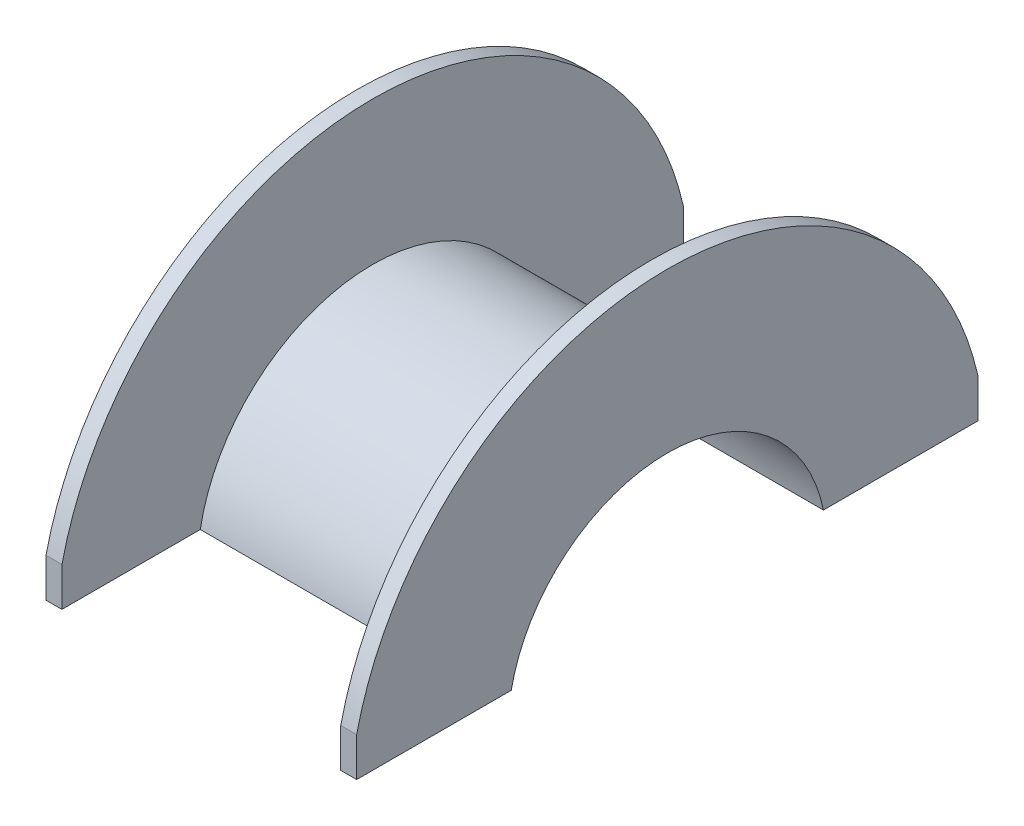
ISO-10303-21;
HEADER;
FILE_DESCRIPTION(('STEP AP214'),'2;1');
FILE_NAME('part.step','',(''),(''),'','','');
FILE_SCHEMA(('AUTOMOTIVE_DESIGN { 1 0 10303 214 1 1 1 1 }'));
ENDSEC;
DATA;
#1=APPLICATION_CONTEXT('core data for automotive mechanical design processes');
#2=APPLICATION_PROTOCOL_DEFINITION('international standard','automotive_design',2000,#1);
#3=PRODUCT_CONTEXT('',#1,'mechanical');
#4=PRODUCT('Part','Part','',(#3));
#5=PRODUCT_RELATED_PRODUCT_CATEGORY('part','',(#4));
#6=PRODUCT_DEFINITION_FORMATION('','',#4);
#7=PRODUCT_DEFINITION_CONTEXT('part definition',#1,'design');
#8=PRODUCT_DEFINITION('design','',#6,#7);
#9=PRODUCT_DEFINITION_SHAPE('','',#8);
#10=(LENGTH_UNIT() NAMED_UNIT(*) SI_UNIT(.MILLI.,.METRE.));
#11=(NAMED_UNIT(*) PLANE_ANGLE_UNIT() SI_UNIT($,.RADIAN.));
#12=(NAMED_UNIT(*) SI_UNIT($,.STERADIAN.) SOLID_ANGLE_UNIT());
#13=UNCERTAINTY_MEASURE_WITH_UNIT(LENGTH_MEASURE(1.E-05),#10,'distance_accuracy_value','');
#14=(GEOMETRIC_REPRESENTATION_CONTEXT(3) GLOBAL_UNCERTAINTY_ASSIGNED_CONTEXT((#13)) GLOBAL_UNIT_ASSIGNED_CONTEXT((#10,
#11,#12)) REPRESENTATION_CONTEXT('',''));
#15=CARTESIAN_POINT('',(0.,0.,0.));
#16=DIRECTION('',(0.,0.,1.));
#17=DIRECTION('',(1.,0.,0.));
#18=AXIS2_PLACEMENT_3D('',#15,#16,#17);
#19=CARTESIAN_POINT('',(-9.75,20.,0.));
#20=DIRECTION('',(1.,0.,0.));
#21=DIRECTION('',(0.,0.,-1.));
#22=AXIS2_PLACEMENT_3D('',#19,#20,#21);
#23=PLANE('',#22);
#24=CARTESIAN_POINT('',(-9.75,0.,0.));
#25=DIRECTION('',(-1.,0.,0.));
#26=DIRECTION('',(0.,0.,1.));
#27=AXIS2_PLACEMENT_3D('',#24,#25,#26);
#28=CIRCLE('',#27,20.);
#29=CARTESIAN_POINT('',(-9.75,4.4440972086578,19.5));
#30=VERTEX_POINT('',#29);
#31=CARTESIAN_POINT('',(-9.75,4.4440972086578,-19.5));
#32=VERTEX_POINT('',#31);
#33=EDGE_CURVE('E214',#30,#32,#28,.T.);
#34=ORIENTED_EDGE('',*,*,#33,.T.);
#35=DIRECTION('',(0.,-1.,0.));
#36=VECTOR('',#35,1.);
#37=CARTESIAN_POINT('',(-9.75,20.,-19.5));
#38=LINE('',#37,#36);
#39=CARTESIAN_POINT('',(-9.75,2.,-19.5));
#40=VERTEX_POINT('',#39);
#41=EDGE_CURVE('E173',#32,#40,#38,.T.);
#42=ORIENTED_EDGE('',*,*,#41,.T.);
#43=DIRECTION('',(0.,0.,1.));
#44=VECTOR('',#43,1.);
#45=CARTESIAN_POINT('',(-9.75,2.,0.));
#46=LINE('',#45,#44);
#47=CARTESIAN_POINT('',(-9.75,2.,-9.79795897113272));
#48=VERTEX_POINT('',#47);
#49=EDGE_CURVE('E206',#40,#48,#46,.T.);
#50=ORIENTED_EDGE('',*,*,#49,.T.);
#51=CARTESIAN_POINT('',(-9.75,0.,0.));
#52=DIRECTION('',(-1.,0.,0.));
#53=DIRECTION('',(0.,0.,1.));
#54=AXIS2_PLACEMENT_3D('',#51,#52,#53);
#55=CIRCLE('',#54,10.);
#56=CARTESIAN_POINT('',(-9.75,2.,9.79795897113272));
#57=VERTEX_POINT('',#56);
#58=EDGE_CURVE('E142',#57,#48,#55,.T.);
#59=ORIENTED_EDGE('',*,*,#58,.F.);
#60=CARTESIAN_POINT('',(-9.75,2.,19.5));
#61=VERTEX_POINT('',#60);
#62=EDGE_CURVE('E203',#57,#61,#46,.T.);
#63=ORIENTED_EDGE('',*,*,#62,.T.);
#64=DIRECTION('',(0.,1.,0.));
#65=VECTOR('',#64,1.);
#66=CARTESIAN_POINT('',(-9.75,20.,19.5));
#67=LINE('',#66,#65);
#68=EDGE_CURVE('E184',#61,#30,#67,.T.);
#69=ORIENTED_EDGE('',*,*,#68,.T.);
#70=EDGE_LOOP('',(#34,#42,#50,#59,#63,#69));
#71=FACE_BOUND('',#70,.T.);
#72=ADVANCED_FACE('F33',(#71),#23,.F.);
#73=CARTESIAN_POINT('',(-17.3367237687366,0.,0.));
#74=DIRECTION('',(-1.,0.,0.));
#75=DIRECTION('',(0.,0.,1.));
#76=AXIS2_PLACEMENT_3D('',#73,#74,#75);
#77=CYLINDRICAL_SURFACE('',#76,10.);
#78=ORIENTED_EDGE('',*,*,#58,.T.);
#79=DIRECTION('',(-1.,0.,0.));
#80=VECTOR('',#79,1.);
#81=CARTESIAN_POINT('',(-17.3367237687366,2.,-9.79795897113272));
#82=LINE('',#81,#80);
#83=CARTESIAN_POINT('',(9.75,2.,-9.79795897113272));
#84=VERTEX_POINT('',#83);
#85=EDGE_CURVE('E212',#48,#84,#82,.F.);
#86=ORIENTED_EDGE('',*,*,#85,.T.);
#87=CARTESIAN_POINT('',(9.75,0.,0.));
#88=DIRECTION('',(-1.,0.,0.));
#89=DIRECTION('',(0.,0.,1.));
#90=AXIS2_PLACEMENT_3D('',#87,#88,#89);
#91=CIRCLE('',#90,10.);
#92=CARTESIAN_POINT('',(9.75,2.,9.79795897113272));
#93=VERTEX_POINT('',#92);
#94=EDGE_CURVE('E139',#93,#84,#91,.T.);
#95=ORIENTED_EDGE('',*,*,#94,.F.);
#96=DIRECTION('',(-1.,0.,0.));
#97=VECTOR('',#96,1.);
#98=CARTESIAN_POINT('',(-17.3367237687366,2.,9.79795897113272));
#99=LINE('',#98,#97);
#100=EDGE_CURVE('E205',#93,#57,#99,.T.);
#101=ORIENTED_EDGE('',*,*,#100,.T.);
#102=EDGE_LOOP('',(#78,#86,#95,#101));
#103=FACE_BOUND('',#102,.T.);
#104=ADVANCED_FACE('F242',(#103),#77,.F.);
#105=CARTESIAN_POINT('',(9.75,20.,0.));
#106=DIRECTION('',(-1.,0.,0.));
#107=DIRECTION('',(0.,0.,1.));
#108=AXIS2_PLACEMENT_3D('',#105,#106,#107);
#109=PLANE('',#108);
#110=DIRECTION('',(0.,0.,1.));
#111=VECTOR('',#110,1.);
#112=CARTESIAN_POINT('',(9.75,2.,26.9171821290084));
#113=LINE('',#112,#111);
#114=CARTESIAN_POINT('',(9.75,2.,-19.5));
#115=VERTEX_POINT('',#114);
#116=EDGE_CURVE('E134',#115,#84,#113,.T.);
#117=ORIENTED_EDGE('',*,*,#116,.F.);
#118=DIRECTION('',(0.,-1.,0.));
#119=VECTOR('',#118,1.);
#120=CARTESIAN_POINT('',(9.75,-1.1099524335408,-19.5));
#121=LINE('',#120,#119);
#122=CARTESIAN_POINT('',(9.75,4.44409720865778,-19.5));
#123=VERTEX_POINT('',#122);
#124=EDGE_CURVE('E47',#123,#115,#121,.T.);
#125=ORIENTED_EDGE('',*,*,#124,.F.);
#126=CARTESIAN_POINT('',(9.75,0.,0.));
#127=DIRECTION('',(-1.,0.,0.));
#128=DIRECTION('',(0.,0.,1.));
#129=AXIS2_PLACEMENT_3D('',#126,#127,#128);
#130=CIRCLE('',#129,20.);
#131=CARTESIAN_POINT('',(9.75,4.44409720865778,19.5));
#132=VERTEX_POINT('',#131);
#133=EDGE_CURVE('E132',#132,#123,#130,.T.);
#134=ORIENTED_EDGE('',*,*,#133,.F.);
#135=DIRECTION('',(0.,1.,0.));
#136=VECTOR('',#135,1.);
#137=CARTESIAN_POINT('',(9.75,-1.47581202367799,19.5));
#138=LINE('',#137,#136);
#139=CARTESIAN_POINT('',(9.75,2.,19.5));
#140=VERTEX_POINT('',#139);
#141=EDGE_CURVE('E179',#140,#132,#138,.T.);
#142=ORIENTED_EDGE('',*,*,#141,.F.);
#143=EDGE_CURVE('E193',#93,#140,#113,.T.);
#144=ORIENTED_EDGE('',*,*,#143,.F.);
#145=ORIENTED_EDGE('',*,*,#94,.T.);
#146=EDGE_LOOP('',(#117,#125,#134,#142,#144,#145));
#147=FACE_BOUND('',#146,.T.);
#148=ADVANCED_FACE('F130',(#147),#109,.F.);
#149=CARTESIAN_POINT('',(-17.3367237687366,0.,0.));
#150=DIRECTION('',(-1.,0.,0.));
#151=DIRECTION('',(0.,0.,1.));
#152=AXIS2_PLACEMENT_3D('',#149,#150,#151);
#153=CYLINDRICAL_SURFACE('',#152,20.);
#154=ORIENTED_EDGE('',*,*,#133,.T.);
#155=DIRECTION('',(-1.,0.,0.));
#156=VECTOR('',#155,1.);
#157=CARTESIAN_POINT('',(-17.3367237687366,4.44409720865778,-19.5));
#158=LINE('',#157,#156);
#159=CARTESIAN_POINT('',(8.75,4.4440972086578,-19.5));
#160=VERTEX_POINT('',#159);
#161=EDGE_CURVE('E118',#123,#160,#158,.T.);
#162=ORIENTED_EDGE('',*,*,#161,.T.);
#163=CARTESIAN_POINT('',(8.75,0.,0.));
#164=DIRECTION('',(-1.,0.,0.));
#165=DIRECTION('',(0.,0.,1.));
#166=AXIS2_PLACEMENT_3D('',#163,#164,#165);
#167=CIRCLE('',#166,20.);
#168=CARTESIAN_POINT('',(8.75,4.4440972086578,19.5));
#169=VERTEX_POINT('',#168);
#170=EDGE_CURVE('E140',#169,#160,#167,.T.);
#171=ORIENTED_EDGE('',*,*,#170,.F.);
#172=DIRECTION('',(-1.,0.,0.));
#173=VECTOR('',#172,1.);
#174=CARTESIAN_POINT('',(-17.3367237687366,4.44409720865778,19.5));
#175=LINE('',#174,#173);
#176=EDGE_CURVE('E138',#169,#132,#175,.F.);
#177=ORIENTED_EDGE('',*,*,#176,.T.);
#178=EDGE_LOOP('',(#154,#162,#171,#177));
#179=FACE_BOUND('',#178,.T.);
#180=ADVANCED_FACE('F137',(#179),#153,.T.);
#181=CARTESIAN_POINT('',(8.75,11.,0.));
#182=DIRECTION('',(1.,0.,0.));
#183=DIRECTION('',(0.,0.,-1.));
#184=AXIS2_PLACEMENT_3D('',#181,#182,#183);
#185=PLANE('',#184);
#186=ORIENTED_EDGE('',*,*,#170,.T.);
#187=DIRECTION('',(0.,-1.,0.));
#188=VECTOR('',#187,1.);
#189=CARTESIAN_POINT('',(8.75,11.,-19.5));
#190=LINE('',#189,#188);
#191=CARTESIAN_POINT('',(8.75,2.,-19.5));
#192=VERTEX_POINT('',#191);
#193=EDGE_CURVE('E121',#160,#192,#190,.T.);
#194=ORIENTED_EDGE('',*,*,#193,.T.);
#195=DIRECTION('',(0.,0.,1.));
#196=VECTOR('',#195,1.);
#197=CARTESIAN_POINT('',(8.75,2.,0.));
#198=LINE('',#197,#196);
#199=CARTESIAN_POINT('',(8.75,2.,-10.816653826392));
#200=VERTEX_POINT('',#199);
#201=EDGE_CURVE('E165',#192,#200,#198,.T.);
#202=ORIENTED_EDGE('',*,*,#201,.T.);
#203=CARTESIAN_POINT('',(8.75,0.,0.));
#204=DIRECTION('',(-1.,0.,0.));
#205=DIRECTION('',(0.,0.,1.));
#206=AXIS2_PLACEMENT_3D('',#203,#204,#205);
#207=CIRCLE('',#206,11.);
#208=CARTESIAN_POINT('',(8.75,2.,10.816653826392));
#209=VERTEX_POINT('',#208);
#210=EDGE_CURVE('E144',#209,#200,#207,.T.);
#211=ORIENTED_EDGE('',*,*,#210,.F.);
#212=CARTESIAN_POINT('',(8.75,2.,19.5));
#213=VERTEX_POINT('',#212);
#214=EDGE_CURVE('E201',#209,#213,#198,.T.);
#215=ORIENTED_EDGE('',*,*,#214,.T.);
#216=DIRECTION('',(0.,1.,0.));
#217=VECTOR('',#216,1.);
#218=CARTESIAN_POINT('',(8.75,11.,19.5));
#219=LINE('',#218,#217);
#220=EDGE_CURVE('E190',#213,#169,#219,.T.);
#221=ORIENTED_EDGE('',*,*,#220,.T.);
#222=EDGE_LOOP('',(#186,#194,#202,#211,#215,#221));
#223=FACE_BOUND('',#222,.T.);
#224=ADVANCED_FACE('F167',(#223),#185,.F.);
#225=CARTESIAN_POINT('',(-17.3367237687366,0.,0.));
#226=DIRECTION('',(-1.,0.,0.));
#227=DIRECTION('',(0.,0.,1.));
#228=AXIS2_PLACEMENT_3D('',#225,#226,#227);
#229=CYLINDRICAL_SURFACE('',#228,11.);
#230=ORIENTED_EDGE('',*,*,#210,.T.);
#231=DIRECTION('',(-1.,0.,0.));
#232=VECTOR('',#231,1.);
#233=CARTESIAN_POINT('',(-17.3367237687366,2.,-10.816653826392));
#234=LINE('',#233,#232);
#235=CARTESIAN_POINT('',(-8.75,2.,-10.816653826392));
#236=VERTEX_POINT('',#235);
#237=EDGE_CURVE('E209',#200,#236,#234,.T.);
#238=ORIENTED_EDGE('',*,*,#237,.T.);
#239=CARTESIAN_POINT('',(-8.75,0.,0.));
#240=DIRECTION('',(-1.,0.,0.));
#241=DIRECTION('',(0.,0.,1.));
#242=AXIS2_PLACEMENT_3D('',#239,#240,#241);
#243=CIRCLE('',#242,11.);
#244=CARTESIAN_POINT('',(-8.75,2.,10.816653826392));
#245=VERTEX_POINT('',#244);
#246=EDGE_CURVE('E220',#245,#236,#243,.T.);
#247=ORIENTED_EDGE('',*,*,#246,.F.);
#248=DIRECTION('',(-1.,0.,0.));
#249=VECTOR('',#248,1.);
#250=CARTESIAN_POINT('',(-17.3367237687366,2.,10.816653826392));
#251=LINE('',#250,#249);
#252=EDGE_CURVE('E197',#245,#209,#251,.F.);
#253=ORIENTED_EDGE('',*,*,#252,.T.);
#254=EDGE_LOOP('',(#230,#238,#247,#253));
#255=FACE_BOUND('',#254,.T.);
#256=ADVANCED_FACE('F224',(#255),#229,.T.);
#257=CARTESIAN_POINT('',(-8.75,20.,0.));
#258=DIRECTION('',(-1.,0.,0.));
#259=DIRECTION('',(0.,0.,1.));
#260=AXIS2_PLACEMENT_3D('',#257,#258,#259);
#261=PLANE('',#260);
#262=DIRECTION('',(0.,0.,-1.));
#263=VECTOR('',#262,1.);
#264=CARTESIAN_POINT('',(-8.75,2.,0.));
#265=LINE('',#264,#263);
#266=CARTESIAN_POINT('',(-8.75,2.,-19.5));
#267=VERTEX_POINT('',#266);
#268=EDGE_CURVE('E198',#236,#267,#265,.T.);
#269=ORIENTED_EDGE('',*,*,#268,.T.);
#270=DIRECTION('',(0.,1.,0.));
#271=VECTOR('',#270,1.);
#272=CARTESIAN_POINT('',(-8.75,20.,-19.5));
#273=LINE('',#272,#271);
#274=CARTESIAN_POINT('',(-8.75,4.4440972086578,-19.5));
#275=VERTEX_POINT('',#274);
#276=EDGE_CURVE('E55',#267,#275,#273,.T.);
#277=ORIENTED_EDGE('',*,*,#276,.T.);
#278=CARTESIAN_POINT('',(-8.75,0.,0.));
#279=DIRECTION('',(-1.,0.,0.));
#280=DIRECTION('',(0.,0.,1.));
#281=AXIS2_PLACEMENT_3D('',#278,#279,#280);
#282=CIRCLE('',#281,20.);
#283=CARTESIAN_POINT('',(-8.75,4.4440972086578,19.5));
#284=VERTEX_POINT('',#283);
#285=EDGE_CURVE('E217',#284,#275,#282,.T.);
#286=ORIENTED_EDGE('',*,*,#285,.F.);
#287=DIRECTION('',(0.,-1.,0.));
#288=VECTOR('',#287,1.);
#289=CARTESIAN_POINT('',(-8.75,20.,19.5));
#290=LINE('',#289,#288);
#291=CARTESIAN_POINT('',(-8.75,2.,19.5));
#292=VERTEX_POINT('',#291);
#293=EDGE_CURVE('E181',#284,#292,#290,.T.);
#294=ORIENTED_EDGE('',*,*,#293,.T.);
#295=EDGE_CURVE('E195',#292,#245,#265,.T.);
#296=ORIENTED_EDGE('',*,*,#295,.T.);
#297=ORIENTED_EDGE('',*,*,#246,.T.);
#298=EDGE_LOOP('',(#269,#277,#286,#294,#296,#297));
#299=FACE_BOUND('',#298,.T.);
#300=ADVANCED_FACE('F230',(#299),#261,.F.);
#301=CARTESIAN_POINT('',(-17.3367237687366,0.,0.));
#302=DIRECTION('',(-1.,0.,0.));
#303=DIRECTION('',(0.,0.,1.));
#304=AXIS2_PLACEMENT_3D('',#301,#302,#303);
#305=CYLINDRICAL_SURFACE('',#304,20.);
#306=ORIENTED_EDGE('',*,*,#285,.T.);
#307=DIRECTION('',(-1.,0.,0.));
#308=VECTOR('',#307,1.);
#309=CARTESIAN_POINT('',(-17.3367237687366,4.4440972086578,-19.5));
#310=LINE('',#309,#308);
#311=EDGE_CURVE('E176',#275,#32,#310,.T.);
#312=ORIENTED_EDGE('',*,*,#311,.T.);
#313=ORIENTED_EDGE('',*,*,#33,.F.);
#314=DIRECTION('',(-1.,0.,0.));
#315=VECTOR('',#314,1.);
#316=CARTESIAN_POINT('',(-17.3367237687366,4.4440972086578,19.5));
#317=LINE('',#316,#315);
#318=EDGE_CURVE('E187',#30,#284,#317,.F.);
#319=ORIENTED_EDGE('',*,*,#318,.T.);
#320=EDGE_LOOP('',(#306,#312,#313,#319));
#321=FACE_BOUND('',#320,.T.);
#322=ADVANCED_FACE('F236',(#321),#305,.T.);
#323=CARTESIAN_POINT('',(-30.25,2.,26.9171821290084));
#324=DIRECTION('',(0.,1.,0.));
#325=DIRECTION('',(0.,0.,1.));
#326=AXIS2_PLACEMENT_3D('',#323,#324,#325);
#327=PLANE('',#326);
#328=ORIENTED_EDGE('',*,*,#143,.T.);
#329=DIRECTION('',(-1.,0.,0.));
#330=VECTOR('',#329,1.);
#331=CARTESIAN_POINT('',(-30.25,2.,19.5));
#332=LINE('',#331,#330);
#333=EDGE_CURVE('E151',#140,#213,#332,.T.);
#334=ORIENTED_EDGE('',*,*,#333,.T.);
#335=ORIENTED_EDGE('',*,*,#214,.F.);
#336=ORIENTED_EDGE('',*,*,#252,.F.);
#337=ORIENTED_EDGE('',*,*,#295,.F.);
#338=EDGE_CURVE('E149',#292,#61,#332,.T.);
#339=ORIENTED_EDGE('',*,*,#338,.T.);
#340=ORIENTED_EDGE('',*,*,#62,.F.);
#341=ORIENTED_EDGE('',*,*,#100,.F.);
#342=EDGE_LOOP('',(#328,#334,#335,#336,#337,#339,#340,#341));
#343=FACE_BOUND('',#342,.T.);
#344=ADVANCED_FACE('F227',(#343),#327,.F.);
#345=ORIENTED_EDGE('',*,*,#49,.F.);
#346=DIRECTION('',(1.,0.,0.));
#347=VECTOR('',#346,1.);
#348=CARTESIAN_POINT('',(-30.25,2.,-19.5));
#349=LINE('',#348,#347);
#350=EDGE_CURVE('E11',#40,#267,#349,.T.);
#351=ORIENTED_EDGE('',*,*,#350,.T.);
#352=ORIENTED_EDGE('',*,*,#268,.F.);
#353=ORIENTED_EDGE('',*,*,#237,.F.);
#354=ORIENTED_EDGE('',*,*,#201,.F.);
#355=EDGE_CURVE('E36',#192,#115,#349,.T.);
#356=ORIENTED_EDGE('',*,*,#355,.T.);
#357=ORIENTED_EDGE('',*,*,#116,.T.);
#358=ORIENTED_EDGE('',*,*,#85,.F.);
#359=EDGE_LOOP('',(#345,#351,#352,#353,#354,#356,#357,#358));
#360=FACE_BOUND('',#359,.T.);
#361=ADVANCED_FACE('F161',(#360),#327,.F.);
#362=CARTESIAN_POINT('',(-10.25,-1.47581202367799,19.5));
#363=DIRECTION('',(0.,0.,-1.));
#364=DIRECTION('',(-1.,0.,0.));
#365=AXIS2_PLACEMENT_3D('',#362,#363,#364);
#366=PLANE('',#365);
#367=ORIENTED_EDGE('',*,*,#68,.F.);
#368=ORIENTED_EDGE('',*,*,#338,.F.);
#369=ORIENTED_EDGE('',*,*,#293,.F.);
#370=ORIENTED_EDGE('',*,*,#318,.F.);
#371=EDGE_LOOP('',(#367,#368,#369,#370));
#372=FACE_BOUND('',#371,.T.);
#373=ADVANCED_FACE('F233',(#372),#366,.F.);
#374=ORIENTED_EDGE('',*,*,#220,.F.);
#375=ORIENTED_EDGE('',*,*,#333,.F.);
#376=ORIENTED_EDGE('',*,*,#141,.T.);
#377=ORIENTED_EDGE('',*,*,#176,.F.);
#378=EDGE_LOOP('',(#374,#375,#376,#377));
#379=FACE_BOUND('',#378,.T.);
#380=ADVANCED_FACE('F244',(#379),#366,.F.);
#381=CARTESIAN_POINT('',(-10.25,-1.1099524335408,-19.5));
#382=DIRECTION('',(0.,0.,1.));
#383=DIRECTION('',(1.,0.,0.));
#384=AXIS2_PLACEMENT_3D('',#381,#382,#383);
#385=PLANE('',#384);
#386=ORIENTED_EDGE('',*,*,#124,.T.);
#387=ORIENTED_EDGE('',*,*,#355,.F.);
#388=ORIENTED_EDGE('',*,*,#193,.F.);
#389=ORIENTED_EDGE('',*,*,#161,.F.);
#390=EDGE_LOOP('',(#386,#387,#388,#389));
#391=FACE_BOUND('',#390,.T.);
#392=ADVANCED_FACE('F119',(#391),#385,.F.);
#393=ORIENTED_EDGE('',*,*,#276,.F.);
#394=ORIENTED_EDGE('',*,*,#350,.F.);
#395=ORIENTED_EDGE('',*,*,#41,.F.);
#396=ORIENTED_EDGE('',*,*,#311,.F.);
#397=EDGE_LOOP('',(#393,#394,#395,#396));
#398=FACE_BOUND('',#397,.T.);
#399=ADVANCED_FACE('F251',(#398),#385,.F.);
#400=CLOSED_SHELL('',(#72,#104,#148,#180,#224,#256,#300,#322,#344,#361,#373,#380,#392,#399));
#401=MANIFOLD_SOLID_BREP('B2',#400);
#402=ADVANCED_BREP_SHAPE_REPRESENTATION('',(#18,#401),#14);
#403=SHAPE_DEFINITION_REPRESENTATION(#9,#402);
ENDSEC;
END-ISO-10303-21;
